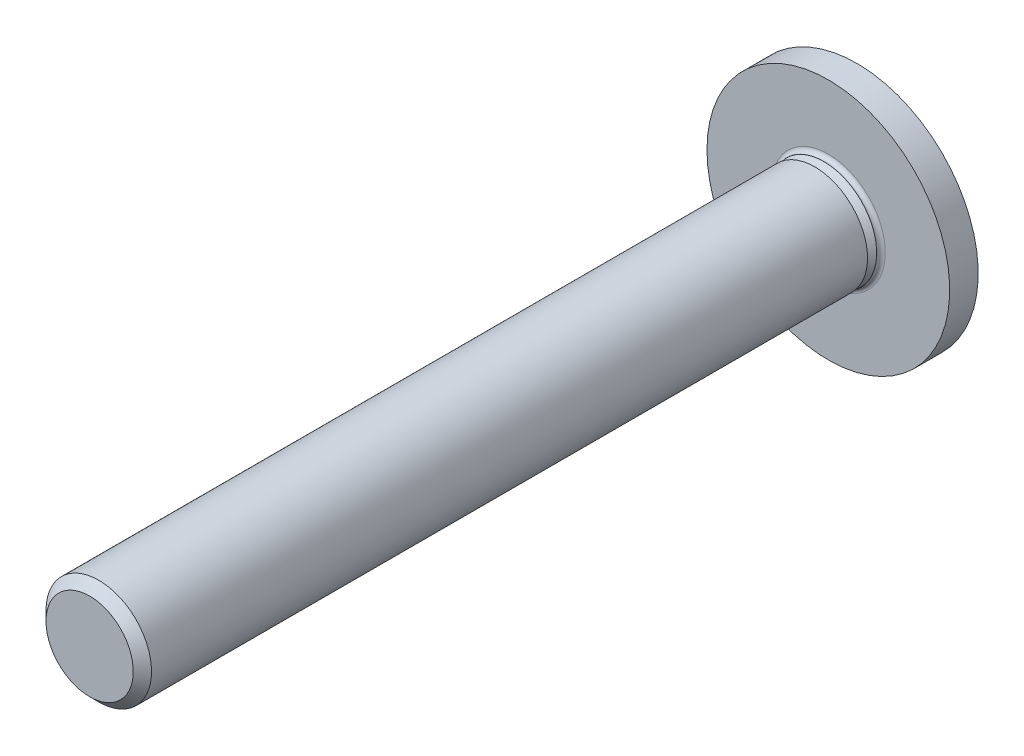
ISO-10303-21;
HEADER;
FILE_DESCRIPTION(('STEP AP214'),'2;1');
FILE_NAME('part.step','',(''),(''),'','','');
FILE_SCHEMA(('AUTOMOTIVE_DESIGN { 1 0 10303 214 1 1 1 1 }'));
ENDSEC;
DATA;
#1=APPLICATION_CONTEXT('core data for automotive mechanical design processes');
#2=APPLICATION_PROTOCOL_DEFINITION('international standard','automotive_design',2000,#1);
#3=PRODUCT_CONTEXT('',#1,'mechanical');
#4=PRODUCT('Part','Part','',(#3));
#5=PRODUCT_RELATED_PRODUCT_CATEGORY('part','',(#4));
#6=PRODUCT_DEFINITION_FORMATION('','',#4);
#7=PRODUCT_DEFINITION_CONTEXT('part definition',#1,'design');
#8=PRODUCT_DEFINITION('design','',#6,#7);
#9=PRODUCT_DEFINITION_SHAPE('','',#8);
#10=(LENGTH_UNIT() NAMED_UNIT(*) SI_UNIT(.MILLI.,.METRE.));
#11=(NAMED_UNIT(*) PLANE_ANGLE_UNIT() SI_UNIT($,.RADIAN.));
#12=(NAMED_UNIT(*) SI_UNIT($,.STERADIAN.) SOLID_ANGLE_UNIT());
#13=UNCERTAINTY_MEASURE_WITH_UNIT(LENGTH_MEASURE(1.E-05),#10,'distance_accuracy_value','');
#14=(GEOMETRIC_REPRESENTATION_CONTEXT(3) GLOBAL_UNCERTAINTY_ASSIGNED_CONTEXT((#13)) GLOBAL_UNIT_ASSIGNED_CONTEXT((#10,
#11,#12)) REPRESENTATION_CONTEXT('',''));
#15=CARTESIAN_POINT('',(0.,0.,0.));
#16=DIRECTION('',(0.,0.,1.));
#17=DIRECTION('',(1.,0.,0.));
#18=AXIS2_PLACEMENT_3D('',#15,#16,#17);
#19=CARTESIAN_POINT('',(0.,0.,6.6));
#20=DIRECTION('',(0.,0.,-1.));
#21=DIRECTION('',(0.,1.,0.));
#22=AXIS2_PLACEMENT_3D('',#19,#20,#21);
#23=SPHERICAL_SURFACE('',#22,6.6);
#24=CARTESIAN_POINT('',(0.,0.,2.2));
#25=DIRECTION('',(0.,0.,-1.));
#26=DIRECTION('',(-1.,0.,0.));
#27=AXIS2_PLACEMENT_3D('',#24,#25,#26);
#28=CIRCLE('',#27,4.91934955049954);
#29=CARTESIAN_POINT('',(-4.91934955049954,0.,2.2));
#30=VERTEX_POINT('',#29);
#31=EDGE_CURVE('E160',#30,#30,#28,.T.);
#32=ORIENTED_EDGE('',*,*,#31,.T.);
#33=EDGE_LOOP('',(#32));
#34=FACE_BOUND('',#33,.T.);
#35=CARTESIAN_POINT('',(-0.282675165232879,0.131813594318321,6.51642730722624));
#36=DIRECTION('',(-0.875426098065593,0.408217893676735,-0.258819045102521));
#37=DIRECTION('',(-0.422618261740699,-0.90630778703665,0.));
#38=AXIS2_PLACEMENT_3D('',#35,#36,#37);
#39=CIRCLE('',#38,6.59209644440492);
#40=CARTESIAN_POINT('',(1.04538251824155,-1.04538251824155,0.167710300281095));
#41=VERTEX_POINT('',#40);
#42=CARTESIAN_POINT('',(0.339356064620156,-2.37864666300932,0.452896819317237));
#43=VERTEX_POINT('',#42);
#44=EDGE_CURVE('E10',#41,#43,#39,.T.);
#45=ORIENTED_EDGE('',*,*,#44,.F.);
#46=CARTESIAN_POINT('',(-0.131813594318321,0.282675165232879,6.51642730722624));
#47=DIRECTION('',(-0.408217893676735,0.875426098065593,-0.258819045102521));
#48=DIRECTION('',(-0.90630778703665,-0.422618261740699,0.));
#49=AXIS2_PLACEMENT_3D('',#46,#47,#48);
#50=CIRCLE('',#49,6.59209644440492);
#51=CARTESIAN_POINT('',(2.37864666300932,-0.339356064620155,0.452896819317238));
#52=VERTEX_POINT('',#51);
#53=EDGE_CURVE('E24',#52,#41,#50,.T.);
#54=ORIENTED_EDGE('',*,*,#53,.F.);
#55=CARTESIAN_POINT('',(0.682531754730549,0.,6.78288383248865));
#56=DIRECTION('',(-0.965925826289068,0.,-0.258819045102521));
#57=DIRECTION('',(-0.258819045102521,0.,0.965925826289068));
#58=AXIS2_PLACEMENT_3D('',#55,#56,#57);
#59=CIRCLE('',#58,6.56206552143445);
#60=CARTESIAN_POINT('',(2.37864666300932,0.339356064620156,0.452896819317239));
#61=VERTEX_POINT('',#60);
#62=EDGE_CURVE('E228',#61,#52,#59,.T.);
#63=ORIENTED_EDGE('',*,*,#62,.F.);
#64=CARTESIAN_POINT('',(-0.131813594318321,-0.282675165232881,6.51642730722624));
#65=DIRECTION('',(-0.408217893676734,-0.875426098065594,-0.258819045102521));
#66=DIRECTION('',(0.90630778703665,-0.422618261740698,0.));
#67=AXIS2_PLACEMENT_3D('',#64,#65,#66);
#68=CIRCLE('',#67,6.59209644440492);
#69=CARTESIAN_POINT('',(1.04538251824155,1.04538251824154,0.167710300281095));
#70=VERTEX_POINT('',#69);
#71=EDGE_CURVE('E225',#70,#61,#68,.T.);
#72=ORIENTED_EDGE('',*,*,#71,.F.);
#73=CARTESIAN_POINT('',(-0.282675165232878,-0.131813594318321,6.51642730722624));
#74=DIRECTION('',(-0.875426098065593,-0.408217893676735,-0.258819045102521));
#75=DIRECTION('',(0.422618261740699,-0.90630778703665,0.));
#76=AXIS2_PLACEMENT_3D('',#73,#74,#75);
#77=CIRCLE('',#76,6.59209644440492);
#78=CARTESIAN_POINT('',(0.339356064620156,2.37864666300932,0.452896819317237));
#79=VERTEX_POINT('',#78);
#80=EDGE_CURVE('E222',#79,#70,#77,.T.);
#81=ORIENTED_EDGE('',*,*,#80,.F.);
#82=CARTESIAN_POINT('',(0.,0.682531754730549,6.78288383248865));
#83=DIRECTION('',(0.,-0.965925826289068,-0.258819045102521));
#84=DIRECTION('',(0.,0.258819045102521,-0.965925826289068));
#85=AXIS2_PLACEMENT_3D('',#82,#83,#84);
#86=CIRCLE('',#85,6.56206552143445);
#87=CARTESIAN_POINT('',(-0.339356064620155,2.37864666300932,0.452896819317237));
#88=VERTEX_POINT('',#87);
#89=EDGE_CURVE('E219',#88,#79,#86,.T.);
#90=ORIENTED_EDGE('',*,*,#89,.F.);
#91=CARTESIAN_POINT('',(0.28267516523288,-0.131813594318321,6.51642730722624));
#92=DIRECTION('',(0.875426098065593,-0.408217893676735,-0.258819045102521));
#93=DIRECTION('',(0.422618261740699,0.90630778703665,0.));
#94=AXIS2_PLACEMENT_3D('',#91,#92,#93);
#95=CIRCLE('',#94,6.59209644440492);
#96=CARTESIAN_POINT('',(-1.04538251824154,1.04538251824155,0.167710300281095));
#97=VERTEX_POINT('',#96);
#98=EDGE_CURVE('E216',#97,#88,#95,.T.);
#99=ORIENTED_EDGE('',*,*,#98,.F.);
#100=CARTESIAN_POINT('',(0.131813594318321,-0.282675165232879,6.51642730722624));
#101=DIRECTION('',(0.408217893676735,-0.875426098065593,-0.258819045102521));
#102=DIRECTION('',(0.90630778703665,0.422618261740699,0.));
#103=AXIS2_PLACEMENT_3D('',#100,#101,#102);
#104=CIRCLE('',#103,6.59209644440492);
#105=CARTESIAN_POINT('',(-2.37864666300933,0.339356064620156,0.452896819317239));
#106=VERTEX_POINT('',#105);
#107=EDGE_CURVE('E213',#106,#97,#104,.T.);
#108=ORIENTED_EDGE('',*,*,#107,.F.);
#109=CARTESIAN_POINT('',(-0.682531754730549,0.,6.78288383248865));
#110=DIRECTION('',(0.965925826289068,0.,-0.258819045102521));
#111=DIRECTION('',(-0.258819045102521,0.,-0.965925826289068));
#112=AXIS2_PLACEMENT_3D('',#109,#110,#111);
#113=CIRCLE('',#112,6.56206552143445);
#114=CARTESIAN_POINT('',(-2.37864666300932,-0.339356064620155,0.452896819317238));
#115=VERTEX_POINT('',#114);
#116=EDGE_CURVE('E210',#115,#106,#113,.T.);
#117=ORIENTED_EDGE('',*,*,#116,.F.);
#118=CARTESIAN_POINT('',(0.131813594318322,0.28267516523288,6.51642730722624));
#119=DIRECTION('',(0.408217893676735,0.875426098065593,-0.258819045102521));
#120=DIRECTION('',(-0.90630778703665,0.422618261740699,0.));
#121=AXIS2_PLACEMENT_3D('',#118,#119,#120);
#122=CIRCLE('',#121,6.59209644440492);
#123=CARTESIAN_POINT('',(-1.04538251824155,-1.04538251824154,0.167710300281096));
#124=VERTEX_POINT('',#123);
#125=EDGE_CURVE('E207',#124,#115,#122,.T.);
#126=ORIENTED_EDGE('',*,*,#125,.F.);
#127=CARTESIAN_POINT('',(0.282675165232879,0.131813594318321,6.51642730722624));
#128=DIRECTION('',(0.875426098065593,0.408217893676735,-0.258819045102521));
#129=DIRECTION('',(-0.422618261740699,0.90630778703665,0.));
#130=AXIS2_PLACEMENT_3D('',#127,#128,#129);
#131=CIRCLE('',#130,6.59209644440492);
#132=CARTESIAN_POINT('',(-0.339356064620156,-2.37864666300932,0.452896819317238));
#133=VERTEX_POINT('',#132);
#134=EDGE_CURVE('E204',#133,#124,#131,.T.);
#135=ORIENTED_EDGE('',*,*,#134,.F.);
#136=CARTESIAN_POINT('',(0.,-0.682531754730549,6.78288383248865));
#137=DIRECTION('',(0.,0.965925826289068,-0.258819045102521));
#138=DIRECTION('',(0.,0.258819045102521,0.965925826289068));
#139=AXIS2_PLACEMENT_3D('',#136,#137,#138);
#140=CIRCLE('',#139,6.56206552143445);
#141=EDGE_CURVE('E201',#43,#133,#140,.T.);
#142=ORIENTED_EDGE('',*,*,#141,.F.);
#143=EDGE_LOOP('',(#45,#54,#63,#72,#81,#90,#99,#108,#117,#126,#135,#142));
#144=FACE_BOUND('',#143,.T.);
#145=ADVANCED_FACE('F15',(#34,#144),#23,.T.);
#146=CARTESIAN_POINT('',(0.,0.,38.55));
#147=DIRECTION('',(0.,0.,-1.));
#148=DIRECTION('',(-1.,0.,0.));
#149=AXIS2_PLACEMENT_3D('',#146,#147,#148);
#150=PLANE('',#149);
#151=CARTESIAN_POINT('',(0.,0.,38.55));
#152=DIRECTION('',(0.,0.,-1.));
#153=DIRECTION('',(-1.,0.,0.));
#154=AXIS2_PLACEMENT_3D('',#151,#152,#153);
#155=CIRCLE('',#154,2.067);
#156=CARTESIAN_POINT('',(-2.067,0.,38.55));
#157=VERTEX_POINT('',#156);
#158=EDGE_CURVE('E197',#157,#157,#155,.T.);
#159=ORIENTED_EDGE('',*,*,#158,.F.);
#160=EDGE_LOOP('',(#159));
#161=FACE_BOUND('',#160,.T.);
#162=ADVANCED_FACE('F17',(#161),#150,.F.);
#163=CARTESIAN_POINT('',(0.,0.,38.55));
#164=DIRECTION('',(0.,0.,-1.));
#165=DIRECTION('',(-1.,0.,0.));
#166=AXIS2_PLACEMENT_3D('',#163,#164,#165);
#167=CONICAL_SURFACE('',#166,2.067,0.785398163397449);
#168=CARTESIAN_POINT('',(0.,0.,38.117));
#169=DIRECTION('',(0.,0.,-1.));
#170=DIRECTION('',(-1.,0.,0.));
#171=AXIS2_PLACEMENT_3D('',#168,#169,#170);
#172=CIRCLE('',#171,2.5);
#173=CARTESIAN_POINT('',(-2.5,0.,38.117));
#174=VERTEX_POINT('',#173);
#175=EDGE_CURVE('E193',#174,#174,#172,.T.);
#176=ORIENTED_EDGE('',*,*,#175,.F.);
#177=EDGE_LOOP('',(#176));
#178=FACE_BOUND('',#177,.T.);
#179=ORIENTED_EDGE('',*,*,#158,.T.);
#180=EDGE_LOOP('',(#179));
#181=FACE_BOUND('',#180,.T.);
#182=ADVANCED_FACE('F249',(#178,#181),#167,.T.);
#183=CARTESIAN_POINT('',(0.,0.,0.));
#184=DIRECTION('',(0.,0.,-1.));
#185=DIRECTION('',(-1.,0.,0.));
#186=AXIS2_PLACEMENT_3D('',#183,#184,#185);
#187=CYLINDRICAL_SURFACE('',#186,2.5);
#188=CARTESIAN_POINT('',(0.,0.,4.193));
#189=DIRECTION('',(0.,0.,-1.));
#190=DIRECTION('',(-1.,0.,0.));
#191=AXIS2_PLACEMENT_3D('',#188,#189,#190);
#192=CIRCLE('',#191,2.5);
#193=CARTESIAN_POINT('',(-2.5,0.,4.193));
#194=VERTEX_POINT('',#193);
#195=EDGE_CURVE('E189',#194,#194,#192,.T.);
#196=ORIENTED_EDGE('',*,*,#195,.F.);
#197=EDGE_LOOP('',(#196));
#198=FACE_BOUND('',#197,.T.);
#199=ORIENTED_EDGE('',*,*,#175,.T.);
#200=EDGE_LOOP('',(#199));
#201=FACE_BOUND('',#200,.T.);
#202=ADVANCED_FACE('F261',(#198,#201),#187,.T.);
#203=CARTESIAN_POINT('',(0.,2.5,4.193));
#204=DIRECTION('',(0.,0.,1.));
#205=DIRECTION('',(1.,0.,0.));
#206=AXIS2_PLACEMENT_3D('',#203,#204,#205);
#207=PLANE('',#206);
#208=CARTESIAN_POINT('',(0.,0.,4.193));
#209=DIRECTION('',(0.,0.,-1.));
#210=DIRECTION('',(-1.,0.,0.));
#211=AXIS2_PLACEMENT_3D('',#208,#209,#210);
#212=CIRCLE('',#211,2.067);
#213=CARTESIAN_POINT('',(-2.067,0.,4.193));
#214=VERTEX_POINT('',#213);
#215=EDGE_CURVE('E185',#214,#214,#212,.T.);
#216=ORIENTED_EDGE('',*,*,#215,.F.);
#217=EDGE_LOOP('',(#216));
#218=FACE_BOUND('',#217,.T.);
#219=ORIENTED_EDGE('',*,*,#195,.T.);
#220=EDGE_LOOP('',(#219));
#221=FACE_BOUND('',#220,.T.);
#222=ADVANCED_FACE('F271',(#218,#221),#207,.F.);
#223=CARTESIAN_POINT('',(0.,0.,4.193));
#224=DIRECTION('',(0.,0.,-1.));
#225=DIRECTION('',(-1.,0.,0.));
#226=AXIS2_PLACEMENT_3D('',#223,#224,#225);
#227=CONICAL_SURFACE('',#226,2.067,0.785398163397448);
#228=CARTESIAN_POINT('',(0.,0.,3.76));
#229=DIRECTION('',(0.,0.,-1.));
#230=DIRECTION('',(-1.,0.,0.));
#231=AXIS2_PLACEMENT_3D('',#228,#229,#230);
#232=CIRCLE('',#231,2.5);
#233=CARTESIAN_POINT('',(-2.5,0.,3.76));
#234=VERTEX_POINT('',#233);
#235=EDGE_CURVE('E181',#234,#234,#232,.T.);
#236=ORIENTED_EDGE('',*,*,#235,.F.);
#237=EDGE_LOOP('',(#236));
#238=FACE_BOUND('',#237,.T.);
#239=ORIENTED_EDGE('',*,*,#215,.T.);
#240=EDGE_LOOP('',(#239));
#241=FACE_BOUND('',#240,.T.);
#242=ADVANCED_FACE('F282',(#238,#241),#227,.T.);
#243=CARTESIAN_POINT('',(0.,0.,0.));
#244=DIRECTION('',(0.,0.,-1.));
#245=DIRECTION('',(-1.,0.,0.));
#246=AXIS2_PLACEMENT_3D('',#243,#244,#245);
#247=CYLINDRICAL_SURFACE('',#246,2.5);
#248=CARTESIAN_POINT('',(0.,0.,3.75));
#249=DIRECTION('',(0.,0.,-1.));
#250=DIRECTION('',(-1.,0.,0.));
#251=AXIS2_PLACEMENT_3D('',#248,#249,#250);
#252=CIRCLE('',#251,2.5);
#253=CARTESIAN_POINT('',(-2.5,0.,3.75));
#254=VERTEX_POINT('',#253);
#255=EDGE_CURVE('E177',#254,#254,#252,.T.);
#256=ORIENTED_EDGE('',*,*,#255,.F.);
#257=EDGE_LOOP('',(#256));
#258=FACE_BOUND('',#257,.T.);
#259=ORIENTED_EDGE('',*,*,#235,.T.);
#260=EDGE_LOOP('',(#259));
#261=FACE_BOUND('',#260,.T.);
#262=ADVANCED_FACE('F293',(#258,#261),#247,.T.);
#263=CARTESIAN_POINT('',(0.,0.,3.75));
#264=DIRECTION('',(0.,0.,-1.));
#265=DIRECTION('',(-1.,0.,0.));
#266=AXIS2_PLACEMENT_3D('',#263,#264,#265);
#267=TOROIDAL_SURFACE('',#266,2.7,0.2);
#268=ORIENTED_EDGE('',*,*,#255,.T.);
#269=EDGE_LOOP('',(#268));
#270=FACE_BOUND('',#269,.T.);
#271=CARTESIAN_POINT('',(0.,0.,3.55));
#272=DIRECTION('',(0.,0.,-1.));
#273=DIRECTION('',(-1.,0.,0.));
#274=AXIS2_PLACEMENT_3D('',#271,#272,#273);
#275=CIRCLE('',#274,2.7);
#276=CARTESIAN_POINT('',(-2.7,0.,3.55));
#277=VERTEX_POINT('',#276);
#278=EDGE_CURVE('E173',#277,#277,#275,.T.);
#279=ORIENTED_EDGE('',*,*,#278,.F.);
#280=EDGE_LOOP('',(#279));
#281=FACE_BOUND('',#280,.T.);
#282=ADVANCED_FACE('F304',(#270,#281),#267,.F.);
#283=CARTESIAN_POINT('',(0.,2.7,3.55));
#284=DIRECTION('',(0.,0.,-1.));
#285=DIRECTION('',(-1.,0.,0.));
#286=AXIS2_PLACEMENT_3D('',#283,#284,#285);
#287=PLANE('',#286);
#288=CARTESIAN_POINT('',(0.,0.,3.55));
#289=DIRECTION('',(0.,0.,-1.));
#290=DIRECTION('',(-1.,0.,0.));
#291=AXIS2_PLACEMENT_3D('',#288,#289,#290);
#292=CIRCLE('',#291,5.75);
#293=CARTESIAN_POINT('',(-5.75,0.,3.55));
#294=VERTEX_POINT('',#293);
#295=EDGE_CURVE('E169',#294,#294,#292,.T.);
#296=ORIENTED_EDGE('',*,*,#295,.F.);
#297=EDGE_LOOP('',(#296));
#298=FACE_BOUND('',#297,.T.);
#299=ORIENTED_EDGE('',*,*,#278,.T.);
#300=EDGE_LOOP('',(#299));
#301=FACE_BOUND('',#300,.T.);
#302=ADVANCED_FACE('F315',(#298,#301),#287,.F.);
#303=CARTESIAN_POINT('',(0.,0.,0.));
#304=DIRECTION('',(0.,0.,-1.));
#305=DIRECTION('',(-1.,0.,0.));
#306=AXIS2_PLACEMENT_3D('',#303,#304,#305);
#307=CYLINDRICAL_SURFACE('',#306,5.75);
#308=CARTESIAN_POINT('',(0.,0.,2.2));
#309=DIRECTION('',(0.,0.,-1.));
#310=DIRECTION('',(-1.,0.,0.));
#311=AXIS2_PLACEMENT_3D('',#308,#309,#310);
#312=CIRCLE('',#311,5.75);
#313=CARTESIAN_POINT('',(-5.75,0.,2.2));
#314=VERTEX_POINT('',#313);
#315=EDGE_CURVE('E164',#314,#314,#312,.T.);
#316=ORIENTED_EDGE('',*,*,#315,.F.);
#317=EDGE_LOOP('',(#316));
#318=FACE_BOUND('',#317,.T.);
#319=ORIENTED_EDGE('',*,*,#295,.T.);
#320=EDGE_LOOP('',(#319));
#321=FACE_BOUND('',#320,.T.);
#322=ADVANCED_FACE('F326',(#318,#321),#307,.T.);
#323=CARTESIAN_POINT('',(0.,5.75,2.2));
#324=DIRECTION('',(0.,0.,1.));
#325=DIRECTION('',(1.,0.,0.));
#326=AXIS2_PLACEMENT_3D('',#323,#324,#325);
#327=PLANE('',#326);
#328=ORIENTED_EDGE('',*,*,#31,.F.);
#329=EDGE_LOOP('',(#328));
#330=FACE_BOUND('',#329,.T.);
#331=ORIENTED_EDGE('',*,*,#315,.T.);
#332=EDGE_LOOP('',(#331));
#333=FACE_BOUND('',#332,.T.);
#334=ADVANCED_FACE('F337',(#330,#333),#327,.F.);
#335=CARTESIAN_POINT('',(0.416666666666667,-2.5,0.));
#336=DIRECTION('',(-0.875426098065593,0.408217893676735,-0.258819045102521));
#337=DIRECTION('',(-0.422618261740699,-0.90630778703665,0.));
#338=AXIS2_PLACEMENT_3D('',#335,#336,#337);
#339=PLANE('',#338);
#340=ORIENTED_EDGE('',*,*,#44,.T.);
#341=DIRECTION('',(0.162689201767992,-0.255370893567974,-0.953057149569945));
#342=VECTOR('',#341,1.);
#343=CARTESIAN_POINT('',(0.416666666666667,-2.5,0.));
#344=LINE('',#343,#342);
#345=CARTESIAN_POINT('',(0.030879102760796,-1.89443482510566,2.26));
#346=VERTEX_POINT('',#345);
#347=EDGE_CURVE('E31',#346,#43,#344,.T.);
#348=ORIENTED_EDGE('',*,*,#347,.F.);
#349=DIRECTION('',(0.422618261740699,0.90630778703665,0.));
#350=VECTOR('',#349,1.);
#351=CARTESIAN_POINT('',(0.144866458810191,-1.64998815120715,2.26));
#352=LINE('',#351,#350);
#353=CARTESIAN_POINT('',(0.623517557518238,-0.623517557518238,2.26));
#354=VERTEX_POINT('',#353);
#355=EDGE_CURVE('E117',#346,#354,#352,.T.);
#356=ORIENTED_EDGE('',*,*,#355,.T.);
#357=DIRECTION('',(0.193899607686987,-0.193899607686987,-0.961668281829896));
#358=VECTOR('',#357,1.);
#359=CARTESIAN_POINT('',(1.10770644338406,-1.10770644338406,-0.141392656262523));
#360=LINE('',#359,#358);
#361=EDGE_CURVE('E165',#354,#41,#360,.T.);
#362=ORIENTED_EDGE('',*,*,#361,.T.);
#363=EDGE_LOOP('',(#340,#348,#356,#362));
#364=FACE_BOUND('',#363,.T.);
#365=ADVANCED_FACE('F116',(#364),#339,.T.);
#366=CARTESIAN_POINT('',(1.07919767263937,-1.07919767263937,0.));
#367=DIRECTION('',(-0.408217893676735,0.875426098065593,-0.258819045102521));
#368=DIRECTION('',(-0.90630778703665,-0.422618261740699,0.));
#369=AXIS2_PLACEMENT_3D('',#366,#367,#368);
#370=PLANE('',#369);
#371=ORIENTED_EDGE('',*,*,#53,.T.);
#372=ORIENTED_EDGE('',*,*,#361,.F.);
#373=DIRECTION('',(0.90630778703665,0.422618261740699,0.));
#374=VECTOR('',#373,1.);
#375=CARTESIAN_POINT('',(0.189975580137029,-0.825681501702756,2.26));
#376=LINE('',#375,#374);
#377=CARTESIAN_POINT('',(1.89443482510566,-0.0308791027607958,2.26));
#378=VERTEX_POINT('',#377);
#379=EDGE_CURVE('E124',#354,#378,#376,.T.);
#380=ORIENTED_EDGE('',*,*,#379,.T.);
#381=DIRECTION('',(0.255370893567974,-0.162689201767992,-0.953057149569945));
#382=VECTOR('',#381,1.);
#383=CARTESIAN_POINT('',(2.5,-0.416666666666666,0.));
#384=LINE('',#383,#382);
#385=EDGE_CURVE('E584',#378,#52,#384,.T.);
#386=ORIENTED_EDGE('',*,*,#385,.T.);
#387=EDGE_LOOP('',(#371,#372,#380,#386));
#388=FACE_BOUND('',#387,.T.);
#389=ADVANCED_FACE('F357',(#388),#370,.T.);
#390=CARTESIAN_POINT('',(2.5,-0.416666666666666,0.));
#391=DIRECTION('',(-0.965925826289068,0.,-0.258819045102521));
#392=DIRECTION('',(-0.258819045102521,0.,0.965925826289068));
#393=AXIS2_PLACEMENT_3D('',#390,#391,#392);
#394=PLANE('',#393);
#395=ORIENTED_EDGE('',*,*,#62,.T.);
#396=ORIENTED_EDGE('',*,*,#385,.F.);
#397=DIRECTION('',(0.,1.,0.));
#398=VECTOR('',#397,1.);
#399=CARTESIAN_POINT('',(1.89443482510566,-1.90591105279169,2.26));
#400=LINE('',#399,#398);
#401=CARTESIAN_POINT('',(1.89443482510566,0.0308791027607958,2.26));
#402=VERTEX_POINT('',#401);
#403=EDGE_CURVE('E131',#378,#402,#400,.T.);
#404=ORIENTED_EDGE('',*,*,#403,.T.);
#405=DIRECTION('',(0.255370893567974,0.162689201767992,-0.953057149569944));
#406=VECTOR('',#405,1.);
#407=CARTESIAN_POINT('',(2.5,0.416666666666667,0.));
#408=LINE('',#407,#406);
#409=EDGE_CURVE('E581',#402,#61,#408,.T.);
#410=ORIENTED_EDGE('',*,*,#409,.T.);
#411=EDGE_LOOP('',(#395,#396,#404,#410));
#412=FACE_BOUND('',#411,.T.);
#413=ADVANCED_FACE('F374',(#412),#394,.T.);
#414=CARTESIAN_POINT('',(2.5,0.416666666666667,0.));
#415=DIRECTION('',(-0.408217893676734,-0.875426098065594,-0.258819045102521));
#416=DIRECTION('',(0.90630778703665,-0.422618261740698,0.));
#417=AXIS2_PLACEMENT_3D('',#414,#415,#416);
#418=PLANE('',#417);
#419=ORIENTED_EDGE('',*,*,#71,.T.);
#420=ORIENTED_EDGE('',*,*,#409,.F.);
#421=DIRECTION('',(-0.90630778703665,0.422618261740698,0.));
#422=VECTOR('',#421,1.);
#423=CARTESIAN_POINT('',(1.64998815120715,0.144866458810191,2.26));
#424=LINE('',#423,#422);
#425=CARTESIAN_POINT('',(0.62351755751824,0.623517557518235,2.26));
#426=VERTEX_POINT('',#425);
#427=EDGE_CURVE('E137',#402,#426,#424,.T.);
#428=ORIENTED_EDGE('',*,*,#427,.T.);
#429=DIRECTION('',(0.193899607686987,0.193899607686987,-0.961668281829896));
#430=VECTOR('',#429,1.);
#431=CARTESIAN_POINT('',(1.10770644338406,1.10770644338406,-0.141392656262523));
#432=LINE('',#431,#430);
#433=EDGE_CURVE('E578',#426,#70,#432,.T.);
#434=ORIENTED_EDGE('',*,*,#433,.T.);
#435=EDGE_LOOP('',(#419,#420,#428,#434));
#436=FACE_BOUND('',#435,.T.);
#437=ADVANCED_FACE('F384',(#436),#418,.T.);
#438=CARTESIAN_POINT('',(1.07919767263937,1.07919767263937,0.));
#439=DIRECTION('',(-0.875426098065593,-0.408217893676735,-0.258819045102521));
#440=DIRECTION('',(0.422618261740699,-0.90630778703665,0.));
#441=AXIS2_PLACEMENT_3D('',#438,#439,#440);
#442=PLANE('',#441);
#443=ORIENTED_EDGE('',*,*,#80,.T.);
#444=ORIENTED_EDGE('',*,*,#433,.F.);
#445=DIRECTION('',(-0.422618261740699,0.90630778703665,0.));
#446=VECTOR('',#445,1.);
#447=CARTESIAN_POINT('',(1.60487902988031,-1.48101891148368,2.26));
#448=LINE('',#447,#446);
#449=CARTESIAN_POINT('',(0.0308791027607964,1.89443482510566,2.26));
#450=VERTEX_POINT('',#449);
#451=EDGE_CURVE('E140',#426,#450,#448,.T.);
#452=ORIENTED_EDGE('',*,*,#451,.T.);
#453=DIRECTION('',(0.162689201767992,0.255370893567974,-0.953057149569945));
#454=VECTOR('',#453,1.);
#455=CARTESIAN_POINT('',(0.416666666666667,2.5,0.));
#456=LINE('',#455,#454);
#457=EDGE_CURVE('E575',#450,#79,#456,.T.);
#458=ORIENTED_EDGE('',*,*,#457,.T.);
#459=EDGE_LOOP('',(#443,#444,#452,#458));
#460=FACE_BOUND('',#459,.T.);
#461=ADVANCED_FACE('F396',(#460),#442,.T.);
#462=CARTESIAN_POINT('',(0.416666666666667,2.5,0.));
#463=DIRECTION('',(0.,-0.965925826289068,-0.258819045102521));
#464=DIRECTION('',(0.,0.258819045102521,-0.965925826289068));
#465=AXIS2_PLACEMENT_3D('',#462,#463,#464);
#466=PLANE('',#465);
#467=ORIENTED_EDGE('',*,*,#89,.T.);
#468=ORIENTED_EDGE('',*,*,#457,.F.);
#469=DIRECTION('',(-1.,0.,0.));
#470=VECTOR('',#469,1.);
#471=CARTESIAN_POINT('',(0.693694892375139,1.89443482510566,2.26));
#472=LINE('',#471,#470);
#473=CARTESIAN_POINT('',(-0.0308791027607957,1.89443482510566,2.26));
#474=VERTEX_POINT('',#473);
#475=EDGE_CURVE('E143',#450,#474,#472,.T.);
#476=ORIENTED_EDGE('',*,*,#475,.T.);
#477=DIRECTION('',(-0.162689201767992,0.255370893567974,-0.953057149569945));
#478=VECTOR('',#477,1.);
#479=CARTESIAN_POINT('',(-0.416666666666666,2.5,0.));
#480=LINE('',#479,#478);
#481=EDGE_CURVE('E572',#474,#88,#480,.T.);
#482=ORIENTED_EDGE('',*,*,#481,.T.);
#483=EDGE_LOOP('',(#467,#468,#476,#482));
#484=FACE_BOUND('',#483,.T.);
#485=ADVANCED_FACE('F408',(#484),#466,.T.);
#486=CARTESIAN_POINT('',(-0.416666666666666,2.5,0.));
#487=DIRECTION('',(0.875426098065593,-0.408217893676735,-0.258819045102521));
#488=DIRECTION('',(0.422618261740699,0.90630778703665,0.));
#489=AXIS2_PLACEMENT_3D('',#486,#487,#488);
#490=PLANE('',#489);
#491=ORIENTED_EDGE('',*,*,#98,.T.);
#492=ORIENTED_EDGE('',*,*,#481,.F.);
#493=DIRECTION('',(-0.422618261740699,-0.90630778703665,0.));
#494=VECTOR('',#493,1.);
#495=CARTESIAN_POINT('',(-1.35708261922675,-0.949617793959686,2.26));
#496=LINE('',#495,#494);
#497=CARTESIAN_POINT('',(-0.623517557518237,0.623517557518239,2.26));
#498=VERTEX_POINT('',#497);
#499=EDGE_CURVE('E146',#474,#498,#496,.T.);
#500=ORIENTED_EDGE('',*,*,#499,.T.);
#501=DIRECTION('',(-0.193899607686987,0.193899607686987,-0.961668281829896));
#502=VECTOR('',#501,1.);
#503=CARTESIAN_POINT('',(-1.10770644338406,1.10770644338406,-0.141392656262523));
#504=LINE('',#503,#502);
#505=EDGE_CURVE('E569',#498,#97,#504,.T.);
#506=ORIENTED_EDGE('',*,*,#505,.T.);
#507=EDGE_LOOP('',(#491,#492,#500,#506));
#508=FACE_BOUND('',#507,.T.);
#509=ADVANCED_FACE('F420',(#508),#490,.T.);
#510=CARTESIAN_POINT('',(-1.07919767263937,1.07919767263937,0.));
#511=DIRECTION('',(0.408217893676735,-0.875426098065593,-0.258819045102521));
#512=DIRECTION('',(0.90630778703665,0.422618261740699,0.));
#513=AXIS2_PLACEMENT_3D('',#510,#511,#512);
#514=PLANE('',#513);
#515=ORIENTED_EDGE('',*,*,#107,.T.);
#516=ORIENTED_EDGE('',*,*,#505,.F.);
#517=DIRECTION('',(-0.90630778703665,-0.422618261740699,0.));
#518=VECTOR('',#517,1.);
#519=CARTESIAN_POINT('',(-0.510394777110435,0.676267576334183,2.26));
#520=LINE('',#519,#518);
#521=CARTESIAN_POINT('',(-1.89443482510566,0.0308791027607963,2.26));
#522=VERTEX_POINT('',#521);
#523=EDGE_CURVE('E149',#498,#522,#520,.T.);
#524=ORIENTED_EDGE('',*,*,#523,.T.);
#525=DIRECTION('',(-0.255370893567974,0.162689201767992,-0.953057149569945));
#526=VECTOR('',#525,1.);
#527=CARTESIAN_POINT('',(-2.5,0.416666666666667,0.));
#528=LINE('',#527,#526);
#529=EDGE_CURVE('E566',#522,#106,#528,.T.);
#530=ORIENTED_EDGE('',*,*,#529,.T.);
#531=EDGE_LOOP('',(#515,#516,#524,#530));
#532=FACE_BOUND('',#531,.T.);
#533=ADVANCED_FACE('F432',(#532),#514,.T.);
#534=CARTESIAN_POINT('',(-2.5,0.416666666666667,0.));
#535=DIRECTION('',(0.965925826289068,0.,-0.258819045102521));
#536=DIRECTION('',(-0.258819045102521,0.,-0.965925826289068));
#537=AXIS2_PLACEMENT_3D('',#534,#535,#536);
#538=PLANE('',#537);
#539=ORIENTED_EDGE('',*,*,#116,.T.);
#540=ORIENTED_EDGE('',*,*,#529,.F.);
#541=DIRECTION('',(0.,-1.,0.));
#542=VECTOR('',#541,1.);
#543=CARTESIAN_POINT('',(-1.89443482510566,-1.90591105279169,2.26));
#544=LINE('',#543,#542);
#545=CARTESIAN_POINT('',(-1.89443482510566,-0.0308791027607952,2.26));
#546=VERTEX_POINT('',#545);
#547=EDGE_CURVE('E152',#522,#546,#544,.T.);
#548=ORIENTED_EDGE('',*,*,#547,.T.);
#549=DIRECTION('',(-0.255370893567974,-0.162689201767992,-0.953057149569945));
#550=VECTOR('',#549,1.);
#551=CARTESIAN_POINT('',(-2.5,-0.416666666666666,0.));
#552=LINE('',#551,#550);
#553=EDGE_CURVE('E561',#546,#115,#552,.T.);
#554=ORIENTED_EDGE('',*,*,#553,.T.);
#555=EDGE_LOOP('',(#539,#540,#548,#554));
#556=FACE_BOUND('',#555,.T.);
#557=ADVANCED_FACE('F444',(#556),#538,.T.);
#558=CARTESIAN_POINT('',(-2.5,-0.416666666666666,0.));
#559=DIRECTION('',(0.408217893676735,0.875426098065593,-0.258819045102521));
#560=DIRECTION('',(-0.90630778703665,0.422618261740699,0.));
#561=AXIS2_PLACEMENT_3D('',#558,#559,#560);
#562=PLANE('',#561);
#563=ORIENTED_EDGE('',*,*,#125,.T.);
#564=ORIENTED_EDGE('',*,*,#553,.F.);
#565=DIRECTION('',(0.90630778703665,-0.422618261740699,0.));
#566=VECTOR('',#565,1.);
#567=CARTESIAN_POINT('',(0.949617793959686,-1.35708261922675,2.26));
#568=LINE('',#567,#566);
#569=CARTESIAN_POINT('',(-0.623517557518239,-0.623517557518236,2.26));
#570=VERTEX_POINT('',#569);
#571=EDGE_CURVE('E155',#546,#570,#568,.T.);
#572=ORIENTED_EDGE('',*,*,#571,.T.);
#573=DIRECTION('',(-0.193899607686987,-0.193899607686987,-0.961668281829896));
#574=VECTOR('',#573,1.);
#575=CARTESIAN_POINT('',(-1.10770644338406,-1.10770644338406,-0.141392656262523));
#576=LINE('',#575,#574);
#577=EDGE_CURVE('E558',#570,#124,#576,.T.);
#578=ORIENTED_EDGE('',*,*,#577,.T.);
#579=EDGE_LOOP('',(#563,#564,#572,#578));
#580=FACE_BOUND('',#579,.T.);
#581=ADVANCED_FACE('F456',(#580),#562,.T.);
#582=CARTESIAN_POINT('',(-1.07919767263937,-1.07919767263937,0.));
#583=DIRECTION('',(0.875426098065593,0.408217893676735,-0.258819045102521));
#584=DIRECTION('',(-0.422618261740699,0.90630778703665,0.));
#585=AXIS2_PLACEMENT_3D('',#582,#583,#584);
#586=PLANE('',#585);
#587=ORIENTED_EDGE('',*,*,#134,.T.);
#588=ORIENTED_EDGE('',*,*,#577,.F.);
#589=DIRECTION('',(0.422618261740699,-0.90630778703665,0.));
#590=VECTOR('',#589,1.);
#591=CARTESIAN_POINT('',(0.102929951843372,-2.18138926873114,2.26));
#592=LINE('',#591,#590);
#593=CARTESIAN_POINT('',(-0.0308791027607961,-1.89443482510566,2.26));
#594=VERTEX_POINT('',#593);
#595=EDGE_CURVE('E112',#570,#594,#592,.T.);
#596=ORIENTED_EDGE('',*,*,#595,.T.);
#597=DIRECTION('',(-0.162689201767992,-0.255370893567974,-0.953057149569945));
#598=VECTOR('',#597,1.);
#599=CARTESIAN_POINT('',(-0.416666666666667,-2.5,0.));
#600=LINE('',#599,#598);
#601=EDGE_CURVE('E107',#594,#133,#600,.T.);
#602=ORIENTED_EDGE('',*,*,#601,.T.);
#603=EDGE_LOOP('',(#587,#588,#596,#602));
#604=FACE_BOUND('',#603,.T.);
#605=ADVANCED_FACE('F468',(#604),#586,.T.);
#606=CARTESIAN_POINT('',(-0.416666666666667,-2.5,0.));
#607=DIRECTION('',(0.,0.965925826289068,-0.258819045102521));
#608=DIRECTION('',(0.,0.258819045102521,0.965925826289068));
#609=AXIS2_PLACEMENT_3D('',#606,#607,#608);
#610=PLANE('',#609);
#611=ORIENTED_EDGE('',*,*,#141,.T.);
#612=ORIENTED_EDGE('',*,*,#601,.F.);
#613=DIRECTION('',(1.,0.,0.));
#614=VECTOR('',#613,1.);
#615=CARTESIAN_POINT('',(0.693694892375139,-1.89443482510566,2.26));
#616=LINE('',#615,#614);
#617=EDGE_CURVE('E104',#594,#346,#616,.T.);
#618=ORIENTED_EDGE('',*,*,#617,.T.);
#619=ORIENTED_EDGE('',*,*,#347,.T.);
#620=EDGE_LOOP('',(#611,#612,#618,#619));
#621=FACE_BOUND('',#620,.T.);
#622=ADVANCED_FACE('F105',(#621),#610,.T.);
#623=CARTESIAN_POINT('',(0.693694892375139,-1.90591105279169,2.26));
#624=DIRECTION('',(0.,0.,-1.));
#625=DIRECTION('',(-1.,0.,0.));
#626=AXIS2_PLACEMENT_3D('',#623,#624,#625);
#627=PLANE('',#626);
#628=ORIENTED_EDGE('',*,*,#355,.F.);
#629=ORIENTED_EDGE('',*,*,#617,.F.);
#630=ORIENTED_EDGE('',*,*,#595,.F.);
#631=ORIENTED_EDGE('',*,*,#571,.F.);
#632=ORIENTED_EDGE('',*,*,#547,.F.);
#633=ORIENTED_EDGE('',*,*,#523,.F.);
#634=ORIENTED_EDGE('',*,*,#499,.F.);
#635=ORIENTED_EDGE('',*,*,#475,.F.);
#636=ORIENTED_EDGE('',*,*,#451,.F.);
#637=ORIENTED_EDGE('',*,*,#427,.F.);
#638=ORIENTED_EDGE('',*,*,#403,.F.);
#639=ORIENTED_EDGE('',*,*,#379,.F.);
#640=EDGE_LOOP('',(#628,#629,#630,#631,#632,#633,#634,#635,#636,#637,#638,#639));
#641=FACE_BOUND('',#640,.T.);
#642=ADVANCED_FACE('F122',(#641),#627,.T.);
#643=CLOSED_SHELL('',(#145,#162,#182,#202,#222,#242,#262,#282,#302,#322,#334,#365,#389,#413,
#437,#461,#485,#509,#533,#557,#581,#605,#622,#642));
#644=MANIFOLD_SOLID_BREP('B1',#643);
#645=ADVANCED_BREP_SHAPE_REPRESENTATION('',(#18,#644),#14);
#646=SHAPE_DEFINITION_REPRESENTATION(#9,#645);
ENDSEC;
END-ISO-10303-21;
